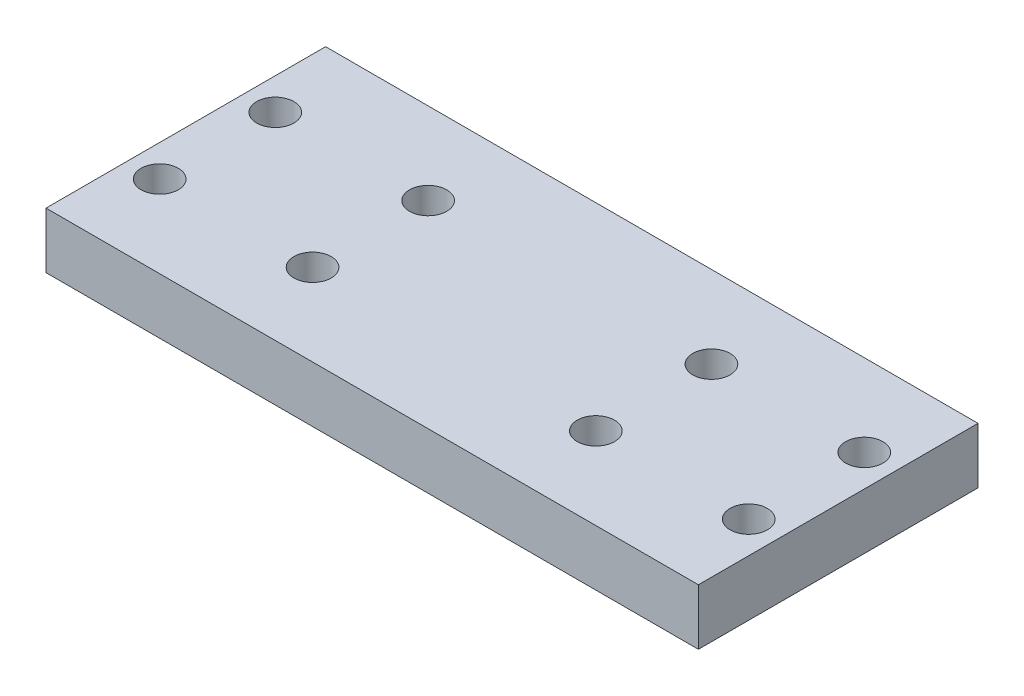
ISO-10303-21;
HEADER;
FILE_DESCRIPTION(('STEP AP214'),'2;1');
FILE_NAME('part.step','',(''),(''),'','','');
FILE_SCHEMA(('AUTOMOTIVE_DESIGN { 1 0 10303 214 1 1 1 1 }'));
ENDSEC;
DATA;
#1=APPLICATION_CONTEXT('core data for automotive mechanical design processes');
#2=APPLICATION_PROTOCOL_DEFINITION('international standard','automotive_design',2000,#1);
#3=PRODUCT_CONTEXT('',#1,'mechanical');
#4=PRODUCT('Part','Part','',(#3));
#5=PRODUCT_RELATED_PRODUCT_CATEGORY('part','',(#4));
#6=PRODUCT_DEFINITION_FORMATION('','',#4);
#7=PRODUCT_DEFINITION_CONTEXT('part definition',#1,'design');
#8=PRODUCT_DEFINITION('design','',#6,#7);
#9=PRODUCT_DEFINITION_SHAPE('','',#8);
#10=(LENGTH_UNIT() NAMED_UNIT(*) SI_UNIT(.MILLI.,.METRE.));
#11=(NAMED_UNIT(*) PLANE_ANGLE_UNIT() SI_UNIT($,.RADIAN.));
#12=(NAMED_UNIT(*) SI_UNIT($,.STERADIAN.) SOLID_ANGLE_UNIT());
#13=UNCERTAINTY_MEASURE_WITH_UNIT(LENGTH_MEASURE(1.E-05),#10,'distance_accuracy_value','');
#14=(GEOMETRIC_REPRESENTATION_CONTEXT(3) GLOBAL_UNCERTAINTY_ASSIGNED_CONTEXT((#13)) GLOBAL_UNIT_ASSIGNED_CONTEXT((#10,
#11,#12)) REPRESENTATION_CONTEXT('',''));
#15=CARTESIAN_POINT('',(0.,0.,0.));
#16=DIRECTION('',(0.,0.,1.));
#17=DIRECTION('',(1.,0.,0.));
#18=AXIS2_PLACEMENT_3D('',#15,#16,#17);
#19=CARTESIAN_POINT('',(0.,30.,0.));
#20=DIRECTION('',(0.,1.,0.));
#21=DIRECTION('',(0.,0.,1.));
#22=AXIS2_PLACEMENT_3D('',#19,#20,#21);
#23=PLANE('',#22);
#24=CARTESIAN_POINT('',(98.,30.,-31.));
#25=DIRECTION('',(0.,1.,0.));
#26=DIRECTION('',(0.,0.,-1.));
#27=AXIS2_PLACEMENT_3D('',#24,#25,#26);
#28=CIRCLE('',#27,10.);
#29=CARTESIAN_POINT('',(98.,30.,-41.));
#30=VERTEX_POINT('',#29);
#31=EDGE_CURVE('E177',#30,#30,#28,.T.);
#32=ORIENTED_EDGE('',*,*,#31,.F.);
#33=EDGE_LOOP('',(#32));
#34=FACE_BOUND('',#33,.T.);
#35=CARTESIAN_POINT('',(16.,30.,31.));
#36=DIRECTION('',(0.,1.,0.));
#37=DIRECTION('',(0.,0.,-1.));
#38=AXIS2_PLACEMENT_3D('',#35,#36,#37);
#39=CIRCLE('',#38,10.);
#40=CARTESIAN_POINT('',(16.,30.,21.));
#41=VERTEX_POINT('',#40);
#42=EDGE_CURVE('E161',#41,#41,#39,.T.);
#43=ORIENTED_EDGE('',*,*,#42,.F.);
#44=EDGE_LOOP('',(#43));
#45=FACE_BOUND('',#44,.T.);
#46=CARTESIAN_POINT('',(-136.,30.,31.));
#47=DIRECTION('',(0.,1.,0.));
#48=DIRECTION('',(0.,0.,1.));
#49=AXIS2_PLACEMENT_3D('',#46,#47,#48);
#50=CIRCLE('',#49,10.);
#51=CARTESIAN_POINT('',(-136.,30.,41.));
#52=VERTEX_POINT('',#51);
#53=EDGE_CURVE('E145',#52,#52,#50,.T.);
#54=ORIENTED_EDGE('',*,*,#53,.F.);
#55=EDGE_LOOP('',(#54));
#56=FACE_BOUND('',#55,.T.);
#57=CARTESIAN_POINT('',(-218.,30.,-31.));
#58=DIRECTION('',(0.,1.,0.));
#59=DIRECTION('',(0.,0.,1.));
#60=AXIS2_PLACEMENT_3D('',#57,#58,#59);
#61=CIRCLE('',#60,10.);
#62=CARTESIAN_POINT('',(-218.,30.,-21.));
#63=VERTEX_POINT('',#62);
#64=EDGE_CURVE('E115',#63,#63,#61,.T.);
#65=ORIENTED_EDGE('',*,*,#64,.F.);
#66=EDGE_LOOP('',(#65));
#67=FACE_BOUND('',#66,.T.);
#68=DIRECTION('',(0.,0.,1.));
#69=VECTOR('',#68,1.);
#70=CARTESIAN_POINT('',(-235.,30.,75.));
#71=LINE('',#70,#69);
#72=CARTESIAN_POINT('',(-235.,30.,-75.));
#73=VERTEX_POINT('',#72);
#74=CARTESIAN_POINT('',(-235.,30.,75.));
#75=VERTEX_POINT('',#74);
#76=EDGE_CURVE('E95',#73,#75,#71,.T.);
#77=ORIENTED_EDGE('',*,*,#76,.T.);
#78=DIRECTION('',(1.,0.,0.));
#79=VECTOR('',#78,1.);
#80=CARTESIAN_POINT('',(115.,30.,75.));
#81=LINE('',#80,#79);
#82=CARTESIAN_POINT('',(115.,30.,75.));
#83=VERTEX_POINT('',#82);
#84=EDGE_CURVE('E90',#75,#83,#81,.T.);
#85=ORIENTED_EDGE('',*,*,#84,.T.);
#86=DIRECTION('',(0.,0.,-1.));
#87=VECTOR('',#86,1.);
#88=CARTESIAN_POINT('',(115.,30.,75.));
#89=LINE('',#88,#87);
#90=CARTESIAN_POINT('',(115.,30.,-75.));
#91=VERTEX_POINT('',#90);
#92=EDGE_CURVE('E93',#83,#91,#89,.T.);
#93=ORIENTED_EDGE('',*,*,#92,.T.);
#94=DIRECTION('',(-1.,0.,0.));
#95=VECTOR('',#94,1.);
#96=CARTESIAN_POINT('',(115.,30.,-75.));
#97=LINE('',#96,#95);
#98=EDGE_CURVE('E60',#91,#73,#97,.T.);
#99=ORIENTED_EDGE('',*,*,#98,.T.);
#100=EDGE_LOOP('',(#77,#85,#93,#99));
#101=FACE_BOUND('',#100,.T.);
#102=CARTESIAN_POINT('',(-136.,30.,-31.));
#103=DIRECTION('',(0.,1.,0.));
#104=DIRECTION('',(0.,0.,1.));
#105=AXIS2_PLACEMENT_3D('',#102,#103,#104);
#106=CIRCLE('',#105,10.);
#107=CARTESIAN_POINT('',(-136.,30.,-21.));
#108=VERTEX_POINT('',#107);
#109=EDGE_CURVE('E137',#108,#108,#106,.T.);
#110=ORIENTED_EDGE('',*,*,#109,.F.);
#111=EDGE_LOOP('',(#110));
#112=FACE_BOUND('',#111,.T.);
#113=CARTESIAN_POINT('',(-218.,30.,31.));
#114=DIRECTION('',(0.,1.,0.));
#115=DIRECTION('',(0.,0.,1.));
#116=AXIS2_PLACEMENT_3D('',#113,#114,#115);
#117=CIRCLE('',#116,10.);
#118=CARTESIAN_POINT('',(-218.,30.,41.));
#119=VERTEX_POINT('',#118);
#120=EDGE_CURVE('E153',#119,#119,#117,.T.);
#121=ORIENTED_EDGE('',*,*,#120,.F.);
#122=EDGE_LOOP('',(#121));
#123=FACE_BOUND('',#122,.T.);
#124=CARTESIAN_POINT('',(16.,30.,-31.));
#125=DIRECTION('',(0.,1.,0.));
#126=DIRECTION('',(0.,0.,-1.));
#127=AXIS2_PLACEMENT_3D('',#124,#125,#126);
#128=CIRCLE('',#127,10.);
#129=CARTESIAN_POINT('',(16.,30.,-41.));
#130=VERTEX_POINT('',#129);
#131=EDGE_CURVE('E169',#130,#130,#128,.T.);
#132=ORIENTED_EDGE('',*,*,#131,.F.);
#133=EDGE_LOOP('',(#132));
#134=FACE_BOUND('',#133,.T.);
#135=CARTESIAN_POINT('',(98.,30.,31.));
#136=DIRECTION('',(0.,1.,0.));
#137=DIRECTION('',(0.,0.,-1.));
#138=AXIS2_PLACEMENT_3D('',#135,#136,#137);
#139=CIRCLE('',#138,10.);
#140=CARTESIAN_POINT('',(98.,30.,21.));
#141=VERTEX_POINT('',#140);
#142=EDGE_CURVE('E185',#141,#141,#139,.T.);
#143=ORIENTED_EDGE('',*,*,#142,.F.);
#144=EDGE_LOOP('',(#143));
#145=FACE_BOUND('',#144,.T.);
#146=ADVANCED_FACE('F42',(#34,#45,#56,#67,#101,#112,#123,#134,#145),#23,.T.);
#147=CARTESIAN_POINT('',(0.,0.,0.));
#148=DIRECTION('',(0.,1.,0.));
#149=DIRECTION('',(0.,0.,1.));
#150=AXIS2_PLACEMENT_3D('',#147,#148,#149);
#151=PLANE('',#150);
#152=DIRECTION('',(0.,0.,1.));
#153=VECTOR('',#152,1.);
#154=CARTESIAN_POINT('',(-235.,0.,75.));
#155=LINE('',#154,#153);
#156=CARTESIAN_POINT('',(-235.,0.,-75.));
#157=VERTEX_POINT('',#156);
#158=CARTESIAN_POINT('',(-235.,0.,75.));
#159=VERTEX_POINT('',#158);
#160=EDGE_CURVE('E111',#157,#159,#155,.T.);
#161=ORIENTED_EDGE('',*,*,#160,.F.);
#162=DIRECTION('',(-1.,0.,0.));
#163=VECTOR('',#162,1.);
#164=CARTESIAN_POINT('',(115.,0.,-75.));
#165=LINE('',#164,#163);
#166=CARTESIAN_POINT('',(115.,0.,-75.));
#167=VERTEX_POINT('',#166);
#168=EDGE_CURVE('E83',#167,#157,#165,.T.);
#169=ORIENTED_EDGE('',*,*,#168,.F.);
#170=DIRECTION('',(0.,0.,-1.));
#171=VECTOR('',#170,1.);
#172=CARTESIAN_POINT('',(115.,0.,75.));
#173=LINE('',#172,#171);
#174=CARTESIAN_POINT('',(115.,0.,75.));
#175=VERTEX_POINT('',#174);
#176=EDGE_CURVE('E77',#175,#167,#173,.T.);
#177=ORIENTED_EDGE('',*,*,#176,.F.);
#178=DIRECTION('',(1.,0.,0.));
#179=VECTOR('',#178,1.);
#180=CARTESIAN_POINT('',(115.,0.,75.));
#181=LINE('',#180,#179);
#182=EDGE_CURVE('E100',#159,#175,#181,.T.);
#183=ORIENTED_EDGE('',*,*,#182,.F.);
#184=EDGE_LOOP('',(#161,#169,#177,#183));
#185=FACE_BOUND('',#184,.T.);
#186=CARTESIAN_POINT('',(-218.,0.,-31.));
#187=DIRECTION('',(0.,1.,0.));
#188=DIRECTION('',(0.,0.,1.));
#189=AXIS2_PLACEMENT_3D('',#186,#187,#188);
#190=CIRCLE('',#189,10.);
#191=CARTESIAN_POINT('',(-218.,0.,-21.));
#192=VERTEX_POINT('',#191);
#193=EDGE_CURVE('E133',#192,#192,#190,.T.);
#194=ORIENTED_EDGE('',*,*,#193,.T.);
#195=EDGE_LOOP('',(#194));
#196=FACE_BOUND('',#195,.T.);
#197=CARTESIAN_POINT('',(-136.,0.,-31.));
#198=DIRECTION('',(0.,1.,0.));
#199=DIRECTION('',(0.,0.,1.));
#200=AXIS2_PLACEMENT_3D('',#197,#198,#199);
#201=CIRCLE('',#200,10.);
#202=CARTESIAN_POINT('',(-136.,0.,-21.));
#203=VERTEX_POINT('',#202);
#204=EDGE_CURVE('E141',#203,#203,#201,.T.);
#205=ORIENTED_EDGE('',*,*,#204,.T.);
#206=EDGE_LOOP('',(#205));
#207=FACE_BOUND('',#206,.T.);
#208=CARTESIAN_POINT('',(-136.,0.,31.));
#209=DIRECTION('',(0.,1.,0.));
#210=DIRECTION('',(0.,0.,1.));
#211=AXIS2_PLACEMENT_3D('',#208,#209,#210);
#212=CIRCLE('',#211,10.);
#213=CARTESIAN_POINT('',(-136.,0.,41.));
#214=VERTEX_POINT('',#213);
#215=EDGE_CURVE('E149',#214,#214,#212,.T.);
#216=ORIENTED_EDGE('',*,*,#215,.T.);
#217=EDGE_LOOP('',(#216));
#218=FACE_BOUND('',#217,.T.);
#219=CARTESIAN_POINT('',(-218.,0.,31.));
#220=DIRECTION('',(0.,1.,0.));
#221=DIRECTION('',(0.,0.,1.));
#222=AXIS2_PLACEMENT_3D('',#219,#220,#221);
#223=CIRCLE('',#222,10.);
#224=CARTESIAN_POINT('',(-218.,0.,41.));
#225=VERTEX_POINT('',#224);
#226=EDGE_CURVE('E157',#225,#225,#223,.T.);
#227=ORIENTED_EDGE('',*,*,#226,.T.);
#228=EDGE_LOOP('',(#227));
#229=FACE_BOUND('',#228,.T.);
#230=CARTESIAN_POINT('',(16.,0.,31.));
#231=DIRECTION('',(0.,1.,0.));
#232=DIRECTION('',(0.,0.,-1.));
#233=AXIS2_PLACEMENT_3D('',#230,#231,#232);
#234=CIRCLE('',#233,10.);
#235=CARTESIAN_POINT('',(16.,0.,21.));
#236=VERTEX_POINT('',#235);
#237=EDGE_CURVE('E165',#236,#236,#234,.T.);
#238=ORIENTED_EDGE('',*,*,#237,.T.);
#239=EDGE_LOOP('',(#238));
#240=FACE_BOUND('',#239,.T.);
#241=CARTESIAN_POINT('',(16.,0.,-31.));
#242=DIRECTION('',(0.,1.,0.));
#243=DIRECTION('',(0.,0.,-1.));
#244=AXIS2_PLACEMENT_3D('',#241,#242,#243);
#245=CIRCLE('',#244,10.);
#246=CARTESIAN_POINT('',(16.,0.,-41.));
#247=VERTEX_POINT('',#246);
#248=EDGE_CURVE('E173',#247,#247,#245,.T.);
#249=ORIENTED_EDGE('',*,*,#248,.T.);
#250=EDGE_LOOP('',(#249));
#251=FACE_BOUND('',#250,.T.);
#252=CARTESIAN_POINT('',(98.,0.,-31.));
#253=DIRECTION('',(0.,1.,0.));
#254=DIRECTION('',(0.,0.,-1.));
#255=AXIS2_PLACEMENT_3D('',#252,#253,#254);
#256=CIRCLE('',#255,10.);
#257=CARTESIAN_POINT('',(98.,0.,-41.));
#258=VERTEX_POINT('',#257);
#259=EDGE_CURVE('E181',#258,#258,#256,.T.);
#260=ORIENTED_EDGE('',*,*,#259,.T.);
#261=EDGE_LOOP('',(#260));
#262=FACE_BOUND('',#261,.T.);
#263=CARTESIAN_POINT('',(98.,0.,31.));
#264=DIRECTION('',(0.,1.,0.));
#265=DIRECTION('',(0.,0.,-1.));
#266=AXIS2_PLACEMENT_3D('',#263,#264,#265);
#267=CIRCLE('',#266,10.);
#268=CARTESIAN_POINT('',(98.,0.,21.));
#269=VERTEX_POINT('',#268);
#270=EDGE_CURVE('E189',#269,#269,#267,.T.);
#271=ORIENTED_EDGE('',*,*,#270,.T.);
#272=EDGE_LOOP('',(#271));
#273=FACE_BOUND('',#272,.T.);
#274=ADVANCED_FACE('F128',(#185,#196,#207,#218,#229,#240,#251,#262,#273),#151,.F.);
#275=CARTESIAN_POINT('',(-235.,30.,75.));
#276=DIRECTION('',(1.,0.,0.));
#277=DIRECTION('',(0.,0.,-1.));
#278=AXIS2_PLACEMENT_3D('',#275,#276,#277);
#279=PLANE('',#278);
#280=ORIENTED_EDGE('',*,*,#160,.T.);
#281=DIRECTION('',(0.,-1.,0.));
#282=VECTOR('',#281,1.);
#283=CARTESIAN_POINT('',(-235.,30.,75.));
#284=LINE('',#283,#282);
#285=EDGE_CURVE('E11',#75,#159,#284,.T.);
#286=ORIENTED_EDGE('',*,*,#285,.F.);
#287=ORIENTED_EDGE('',*,*,#76,.F.);
#288=DIRECTION('',(0.,-1.,0.));
#289=VECTOR('',#288,1.);
#290=CARTESIAN_POINT('',(-235.,30.,-75.));
#291=LINE('',#290,#289);
#292=EDGE_CURVE('E107',#73,#157,#291,.T.);
#293=ORIENTED_EDGE('',*,*,#292,.T.);
#294=EDGE_LOOP('',(#280,#286,#287,#293));
#295=FACE_BOUND('',#294,.T.);
#296=ADVANCED_FACE('F44',(#295),#279,.F.);
#297=CARTESIAN_POINT('',(115.,30.,75.));
#298=DIRECTION('',(0.,0.,-1.));
#299=DIRECTION('',(-1.,0.,0.));
#300=AXIS2_PLACEMENT_3D('',#297,#298,#299);
#301=PLANE('',#300);
#302=ORIENTED_EDGE('',*,*,#182,.T.);
#303=DIRECTION('',(0.,-1.,0.));
#304=VECTOR('',#303,1.);
#305=CARTESIAN_POINT('',(115.,30.,75.));
#306=LINE('',#305,#304);
#307=EDGE_CURVE('E52',#83,#175,#306,.T.);
#308=ORIENTED_EDGE('',*,*,#307,.F.);
#309=ORIENTED_EDGE('',*,*,#84,.F.);
#310=ORIENTED_EDGE('',*,*,#285,.T.);
#311=EDGE_LOOP('',(#302,#308,#309,#310));
#312=FACE_BOUND('',#311,.T.);
#313=ADVANCED_FACE('F99',(#312),#301,.F.);
#314=CARTESIAN_POINT('',(115.,30.,75.));
#315=DIRECTION('',(-1.,0.,0.));
#316=DIRECTION('',(0.,0.,1.));
#317=AXIS2_PLACEMENT_3D('',#314,#315,#316);
#318=PLANE('',#317);
#319=ORIENTED_EDGE('',*,*,#176,.T.);
#320=DIRECTION('',(0.,-1.,0.));
#321=VECTOR('',#320,1.);
#322=CARTESIAN_POINT('',(115.,30.,-75.));
#323=LINE('',#322,#321);
#324=EDGE_CURVE('E102',#91,#167,#323,.T.);
#325=ORIENTED_EDGE('',*,*,#324,.F.);
#326=ORIENTED_EDGE('',*,*,#92,.F.);
#327=ORIENTED_EDGE('',*,*,#307,.T.);
#328=EDGE_LOOP('',(#319,#325,#326,#327));
#329=FACE_BOUND('',#328,.T.);
#330=ADVANCED_FACE('F103',(#329),#318,.F.);
#331=CARTESIAN_POINT('',(115.,30.,-75.));
#332=DIRECTION('',(0.,0.,1.));
#333=DIRECTION('',(1.,0.,0.));
#334=AXIS2_PLACEMENT_3D('',#331,#332,#333);
#335=PLANE('',#334);
#336=ORIENTED_EDGE('',*,*,#168,.T.);
#337=ORIENTED_EDGE('',*,*,#292,.F.);
#338=ORIENTED_EDGE('',*,*,#98,.F.);
#339=ORIENTED_EDGE('',*,*,#324,.T.);
#340=EDGE_LOOP('',(#336,#337,#338,#339));
#341=FACE_BOUND('',#340,.T.);
#342=ADVANCED_FACE('F125',(#341),#335,.F.);
#343=CARTESIAN_POINT('',(-218.,30.,-31.));
#344=DIRECTION('',(0.,-1.,0.));
#345=DIRECTION('',(0.,0.,-1.));
#346=AXIS2_PLACEMENT_3D('',#343,#344,#345);
#347=CYLINDRICAL_SURFACE('',#346,10.);
#348=ORIENTED_EDGE('',*,*,#64,.T.);
#349=EDGE_LOOP('',(#348));
#350=FACE_BOUND('',#349,.T.);
#351=ORIENTED_EDGE('',*,*,#193,.F.);
#352=EDGE_LOOP('',(#351));
#353=FACE_BOUND('',#352,.T.);
#354=ADVANCED_FACE('F210',(#350,#353),#347,.F.);
#355=CARTESIAN_POINT('',(-136.,30.,-31.));
#356=DIRECTION('',(0.,-1.,0.));
#357=DIRECTION('',(0.,0.,-1.));
#358=AXIS2_PLACEMENT_3D('',#355,#356,#357);
#359=CYLINDRICAL_SURFACE('',#358,10.);
#360=ORIENTED_EDGE('',*,*,#109,.T.);
#361=EDGE_LOOP('',(#360));
#362=FACE_BOUND('',#361,.T.);
#363=ORIENTED_EDGE('',*,*,#204,.F.);
#364=EDGE_LOOP('',(#363));
#365=FACE_BOUND('',#364,.T.);
#366=ADVANCED_FACE('F264',(#362,#365),#359,.F.);
#367=CARTESIAN_POINT('',(-136.,30.,31.));
#368=DIRECTION('',(0.,-1.,0.));
#369=DIRECTION('',(0.,0.,-1.));
#370=AXIS2_PLACEMENT_3D('',#367,#368,#369);
#371=CYLINDRICAL_SURFACE('',#370,10.);
#372=ORIENTED_EDGE('',*,*,#53,.T.);
#373=EDGE_LOOP('',(#372));
#374=FACE_BOUND('',#373,.T.);
#375=ORIENTED_EDGE('',*,*,#215,.F.);
#376=EDGE_LOOP('',(#375));
#377=FACE_BOUND('',#376,.T.);
#378=ADVANCED_FACE('F273',(#374,#377),#371,.F.);
#379=CARTESIAN_POINT('',(-218.,30.,31.));
#380=DIRECTION('',(0.,-1.,0.));
#381=DIRECTION('',(0.,0.,-1.));
#382=AXIS2_PLACEMENT_3D('',#379,#380,#381);
#383=CYLINDRICAL_SURFACE('',#382,10.);
#384=ORIENTED_EDGE('',*,*,#120,.T.);
#385=EDGE_LOOP('',(#384));
#386=FACE_BOUND('',#385,.T.);
#387=ORIENTED_EDGE('',*,*,#226,.F.);
#388=EDGE_LOOP('',(#387));
#389=FACE_BOUND('',#388,.T.);
#390=ADVANCED_FACE('F282',(#386,#389),#383,.F.);
#391=CARTESIAN_POINT('',(16.,30.,31.));
#392=DIRECTION('',(0.,-1.,0.));
#393=DIRECTION('',(0.,0.,-1.));
#394=AXIS2_PLACEMENT_3D('',#391,#392,#393);
#395=CYLINDRICAL_SURFACE('',#394,10.);
#396=ORIENTED_EDGE('',*,*,#42,.T.);
#397=EDGE_LOOP('',(#396));
#398=FACE_BOUND('',#397,.T.);
#399=ORIENTED_EDGE('',*,*,#237,.F.);
#400=EDGE_LOOP('',(#399));
#401=FACE_BOUND('',#400,.T.);
#402=ADVANCED_FACE('F292',(#398,#401),#395,.F.);
#403=CARTESIAN_POINT('',(16.,30.,-31.));
#404=DIRECTION('',(0.,-1.,0.));
#405=DIRECTION('',(0.,0.,-1.));
#406=AXIS2_PLACEMENT_3D('',#403,#404,#405);
#407=CYLINDRICAL_SURFACE('',#406,10.);
#408=ORIENTED_EDGE('',*,*,#131,.T.);
#409=EDGE_LOOP('',(#408));
#410=FACE_BOUND('',#409,.T.);
#411=ORIENTED_EDGE('',*,*,#248,.F.);
#412=EDGE_LOOP('',(#411));
#413=FACE_BOUND('',#412,.T.);
#414=ADVANCED_FACE('F302',(#410,#413),#407,.F.);
#415=CARTESIAN_POINT('',(98.,30.,-31.));
#416=DIRECTION('',(0.,-1.,0.));
#417=DIRECTION('',(0.,0.,-1.));
#418=AXIS2_PLACEMENT_3D('',#415,#416,#417);
#419=CYLINDRICAL_SURFACE('',#418,10.);
#420=ORIENTED_EDGE('',*,*,#31,.T.);
#421=EDGE_LOOP('',(#420));
#422=FACE_BOUND('',#421,.T.);
#423=ORIENTED_EDGE('',*,*,#259,.F.);
#424=EDGE_LOOP('',(#423));
#425=FACE_BOUND('',#424,.T.);
#426=ADVANCED_FACE('F312',(#422,#425),#419,.F.);
#427=CARTESIAN_POINT('',(98.,30.,31.));
#428=DIRECTION('',(0.,-1.,0.));
#429=DIRECTION('',(0.,0.,-1.));
#430=AXIS2_PLACEMENT_3D('',#427,#428,#429);
#431=CYLINDRICAL_SURFACE('',#430,10.);
#432=ORIENTED_EDGE('',*,*,#142,.T.);
#433=EDGE_LOOP('',(#432));
#434=FACE_BOUND('',#433,.T.);
#435=ORIENTED_EDGE('',*,*,#270,.F.);
#436=EDGE_LOOP('',(#435));
#437=FACE_BOUND('',#436,.T.);
#438=ADVANCED_FACE('F197',(#434,#437),#431,.F.);
#439=CLOSED_SHELL('',(#146,#274,#296,#313,#330,#342,#354,#366,#378,#390,#402,#414,#426,#438));
#440=MANIFOLD_SOLID_BREP('B2',#439);
#441=ADVANCED_BREP_SHAPE_REPRESENTATION('',(#18,#440),#14);
#442=SHAPE_DEFINITION_REPRESENTATION(#9,#441);
ENDSEC;
END-ISO-10303-21;
